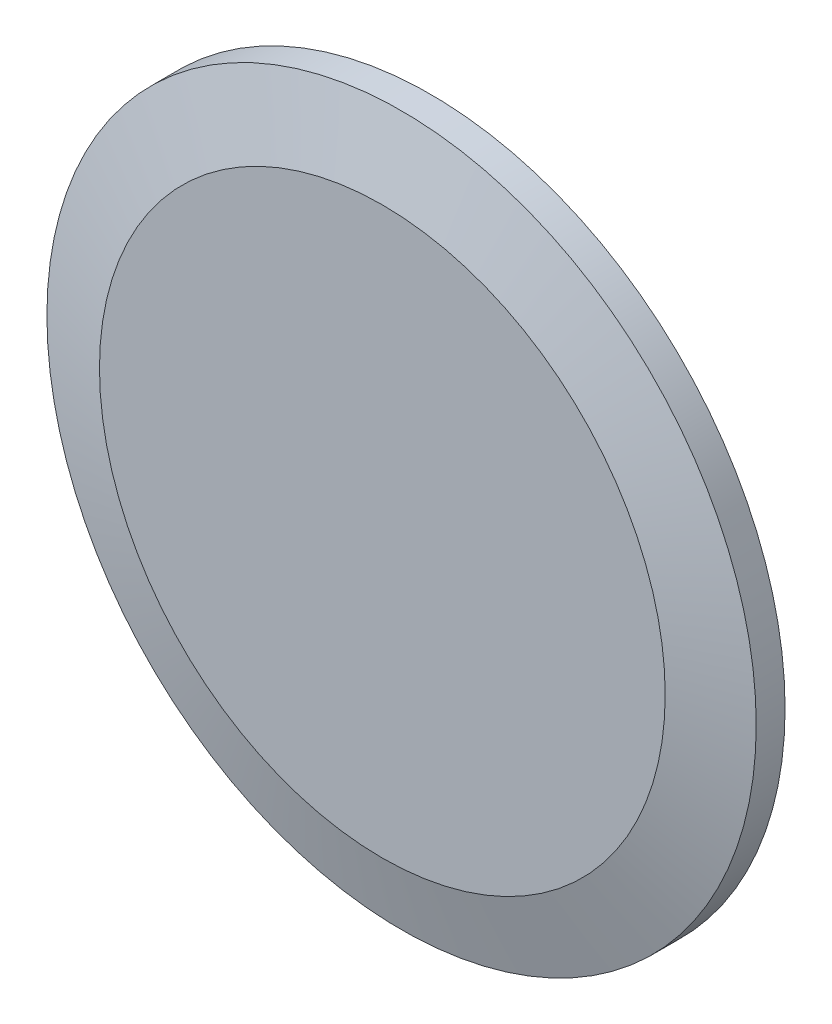
ISO-10303-21;
HEADER;
FILE_DESCRIPTION(('STEP AP214'),'2;1');
FILE_NAME('part.step','',(''),(''),'','','');
FILE_SCHEMA(('AUTOMOTIVE_DESIGN { 1 0 10303 214 1 1 1 1 }'));
ENDSEC;
DATA;
#1=APPLICATION_CONTEXT('core data for automotive mechanical design processes');
#2=APPLICATION_PROTOCOL_DEFINITION('international standard','automotive_design',2000,#1);
#3=PRODUCT_CONTEXT('',#1,'mechanical');
#4=PRODUCT('Part','Part','',(#3));
#5=PRODUCT_RELATED_PRODUCT_CATEGORY('part','',(#4));
#6=PRODUCT_DEFINITION_FORMATION('','',#4);
#7=PRODUCT_DEFINITION_CONTEXT('part definition',#1,'design');
#8=PRODUCT_DEFINITION('design','',#6,#7);
#9=PRODUCT_DEFINITION_SHAPE('','',#8);
#10=(LENGTH_UNIT() NAMED_UNIT(*) SI_UNIT(.MILLI.,.METRE.));
#11=(NAMED_UNIT(*) PLANE_ANGLE_UNIT() SI_UNIT($,.RADIAN.));
#12=(NAMED_UNIT(*) SI_UNIT($,.STERADIAN.) SOLID_ANGLE_UNIT());
#13=UNCERTAINTY_MEASURE_WITH_UNIT(LENGTH_MEASURE(1.E-05),#10,'distance_accuracy_value','');
#14=(GEOMETRIC_REPRESENTATION_CONTEXT(3) GLOBAL_UNCERTAINTY_ASSIGNED_CONTEXT((#13)) GLOBAL_UNIT_ASSIGNED_CONTEXT((#10,
#11,#12)) REPRESENTATION_CONTEXT('',''));
#15=CARTESIAN_POINT('',(0.,0.,0.));
#16=DIRECTION('',(0.,0.,1.));
#17=DIRECTION('',(1.,0.,0.));
#18=AXIS2_PLACEMENT_3D('',#15,#16,#17);
#19=CARTESIAN_POINT('',(0.,0.,-2.54));
#20=DIRECTION('',(0.,0.,-1.));
#21=DIRECTION('',(0.,-1.,0.));
#22=AXIS2_PLACEMENT_3D('',#19,#20,#21);
#23=PLANE('',#22);
#24=CARTESIAN_POINT('',(0.,0.,-2.54));
#25=DIRECTION('',(0.,0.,-1.));
#26=DIRECTION('',(1.,0.,0.));
#27=AXIS2_PLACEMENT_3D('',#24,#25,#26);
#28=CIRCLE('',#27,37.465);
#29=CARTESIAN_POINT('',(37.465,0.,-2.54));
#30=VERTEX_POINT('',#29);
#31=EDGE_CURVE('E11',#30,#30,#28,.T.);
#32=ORIENTED_EDGE('',*,*,#31,.T.);
#33=EDGE_LOOP('',(#32));
#34=FACE_BOUND('',#33,.T.);
#35=CARTESIAN_POINT('',(0.,0.,-2.54));
#36=DIRECTION('',(0.,0.,-1.));
#37=DIRECTION('',(-1.,0.,0.));
#38=AXIS2_PLACEMENT_3D('',#35,#36,#37);
#39=CIRCLE('',#38,26.2255);
#40=CARTESIAN_POINT('',(-26.2255,0.,-2.54));
#41=VERTEX_POINT('',#40);
#42=EDGE_CURVE('E79',#41,#41,#39,.T.);
#43=ORIENTED_EDGE('',*,*,#42,.F.);
#44=EDGE_LOOP('',(#43));
#45=FACE_BOUND('',#44,.T.);
#46=ADVANCED_FACE('F17',(#34,#45),#23,.T.);
#47=CARTESIAN_POINT('',(0.,0.,2.54));
#48=DIRECTION('',(0.,0.,1.));
#49=DIRECTION('',(-1.,0.,0.));
#50=AXIS2_PLACEMENT_3D('',#47,#48,#49);
#51=CYLINDRICAL_SURFACE('',#50,37.465);
#52=CARTESIAN_POINT('',(0.,0.,0.508));
#53=DIRECTION('',(0.,0.,-1.));
#54=DIRECTION('',(-1.,0.,0.));
#55=AXIS2_PLACEMENT_3D('',#52,#53,#54);
#56=CIRCLE('',#55,37.465);
#57=CARTESIAN_POINT('',(-37.465,0.,0.508));
#58=VERTEX_POINT('',#57);
#59=EDGE_CURVE('E21',#58,#58,#56,.T.);
#60=ORIENTED_EDGE('',*,*,#59,.T.);
#61=EDGE_LOOP('',(#60));
#62=FACE_BOUND('',#61,.T.);
#63=ORIENTED_EDGE('',*,*,#31,.F.);
#64=EDGE_LOOP('',(#63));
#65=FACE_BOUND('',#64,.T.);
#66=ADVANCED_FACE('F108',(#62,#65),#51,.T.);
#67=CARTESIAN_POINT('',(0.,0.,-57.));
#68=DIRECTION('',(0.,0.,1.));
#69=DIRECTION('',(-1.,0.,0.));
#70=AXIS2_PLACEMENT_3D('',#67,#68,#69);
#71=CYLINDRICAL_SURFACE('',#70,23.0505);
#72=CARTESIAN_POINT('',(0.,0.,-2.54));
#73=DIRECTION('',(0.,0.,-1.));
#74=DIRECTION('',(-1.,0.,0.));
#75=AXIS2_PLACEMENT_3D('',#72,#73,#74);
#76=CIRCLE('',#75,23.0505);
#77=CARTESIAN_POINT('',(-23.0505,0.,-2.54));
#78=VERTEX_POINT('',#77);
#79=EDGE_CURVE('E57',#78,#78,#76,.T.);
#80=ORIENTED_EDGE('',*,*,#79,.F.);
#81=EDGE_LOOP('',(#80));
#82=FACE_BOUND('',#81,.T.);
#83=CARTESIAN_POINT('',(0.,0.,0.127000000000002));
#84=DIRECTION('',(0.,0.,-1.));
#85=DIRECTION('',(-1.,0.,0.));
#86=AXIS2_PLACEMENT_3D('',#83,#84,#85);
#87=CIRCLE('',#86,23.0505);
#88=CARTESIAN_POINT('',(-23.0505,0.,0.127000000000002));
#89=VERTEX_POINT('',#88);
#90=EDGE_CURVE('E64',#89,#89,#87,.T.);
#91=ORIENTED_EDGE('',*,*,#90,.T.);
#92=EDGE_LOOP('',(#91));
#93=FACE_BOUND('',#92,.T.);
#94=ADVANCED_FACE('F99',(#82,#93),#71,.T.);
#95=CARTESIAN_POINT('',(0.,23.0505,0.127));
#96=DIRECTION('',(0.,0.,-1.));
#97=DIRECTION('',(0.,-1.,0.));
#98=AXIS2_PLACEMENT_3D('',#95,#96,#97);
#99=PLANE('',#98);
#100=CARTESIAN_POINT('',(0.,0.,0.127000000000002));
#101=DIRECTION('',(0.,0.,-1.));
#102=DIRECTION('',(-1.,0.,0.));
#103=AXIS2_PLACEMENT_3D('',#100,#101,#102);
#104=CIRCLE('',#103,26.2255);
#105=CARTESIAN_POINT('',(-26.2255,0.,0.127000000000002));
#106=VERTEX_POINT('',#105);
#107=EDGE_CURVE('E70',#106,#106,#104,.T.);
#108=ORIENTED_EDGE('',*,*,#107,.T.);
#109=EDGE_LOOP('',(#108));
#110=FACE_BOUND('',#109,.T.);
#111=ORIENTED_EDGE('',*,*,#90,.F.);
#112=EDGE_LOOP('',(#111));
#113=FACE_BOUND('',#112,.T.);
#114=ADVANCED_FACE('F96',(#110,#113),#99,.T.);
#115=CARTESIAN_POINT('',(0.,0.,-57.));
#116=DIRECTION('',(0.,0.,1.));
#117=DIRECTION('',(-1.,0.,0.));
#118=AXIS2_PLACEMENT_3D('',#115,#116,#117);
#119=CYLINDRICAL_SURFACE('',#118,26.2255);
#120=ORIENTED_EDGE('',*,*,#107,.F.);
#121=EDGE_LOOP('',(#120));
#122=FACE_BOUND('',#121,.T.);
#123=ORIENTED_EDGE('',*,*,#42,.T.);
#124=EDGE_LOOP('',(#123));
#125=FACE_BOUND('',#124,.T.);
#126=ADVANCED_FACE('F98',(#122,#125),#119,.F.);
#127=CARTESIAN_POINT('',(0.,0.,2.54));
#128=DIRECTION('',(0.,0.,-1.));
#129=DIRECTION('',(0.,-1.,0.));
#130=AXIS2_PLACEMENT_3D('',#127,#128,#129);
#131=PLANE('',#130);
#132=CARTESIAN_POINT('',(0.,0.,2.54));
#133=DIRECTION('',(0.,0.,-1.));
#134=DIRECTION('',(-1.,0.,0.));
#135=AXIS2_PLACEMENT_3D('',#132,#133,#134);
#136=CIRCLE('',#135,29.88147275902);
#137=CARTESIAN_POINT('',(-29.88147275902,0.,2.54));
#138=VERTEX_POINT('',#137);
#139=EDGE_CURVE('E75',#138,#138,#136,.T.);
#140=ORIENTED_EDGE('',*,*,#139,.F.);
#141=EDGE_LOOP('',(#140));
#142=FACE_BOUND('',#141,.T.);
#143=ADVANCED_FACE('F76',(#142),#131,.F.);
#144=CARTESIAN_POINT('',(0.,0.,0.508));
#145=DIRECTION('',(0.,0.,-1.));
#146=DIRECTION('',(-1.,0.,0.));
#147=AXIS2_PLACEMENT_3D('',#144,#145,#146);
#148=CONICAL_SURFACE('',#147,37.465,1.30899693899575);
#149=ORIENTED_EDGE('',*,*,#59,.F.);
#150=EDGE_LOOP('',(#149));
#151=FACE_BOUND('',#150,.T.);
#152=ORIENTED_EDGE('',*,*,#139,.T.);
#153=EDGE_LOOP('',(#152));
#154=FACE_BOUND('',#153,.T.);
#155=ADVANCED_FACE('F164',(#151,#154),#148,.T.);
#156=CARTESIAN_POINT('',(0.,0.,-2.54));
#157=DIRECTION('',(0.,0.,-1.));
#158=DIRECTION('',(0.,-1.,0.));
#159=AXIS2_PLACEMENT_3D('',#156,#157,#158);
#160=PLANE('',#159);
#161=ORIENTED_EDGE('',*,*,#79,.T.);
#162=EDGE_LOOP('',(#161));
#163=FACE_BOUND('',#162,.T.);
#164=ADVANCED_FACE('F19',(#163),#160,.T.);
#165=CLOSED_SHELL('',(#46,#66,#94,#114,#126,#143,#155,#164));
#166=MANIFOLD_SOLID_BREP('B1',#165);
#167=ADVANCED_BREP_SHAPE_REPRESENTATION('',(#18,#166),#14);
#168=SHAPE_DEFINITION_REPRESENTATION(#9,#167);
ENDSEC;
END-ISO-10303-21;
